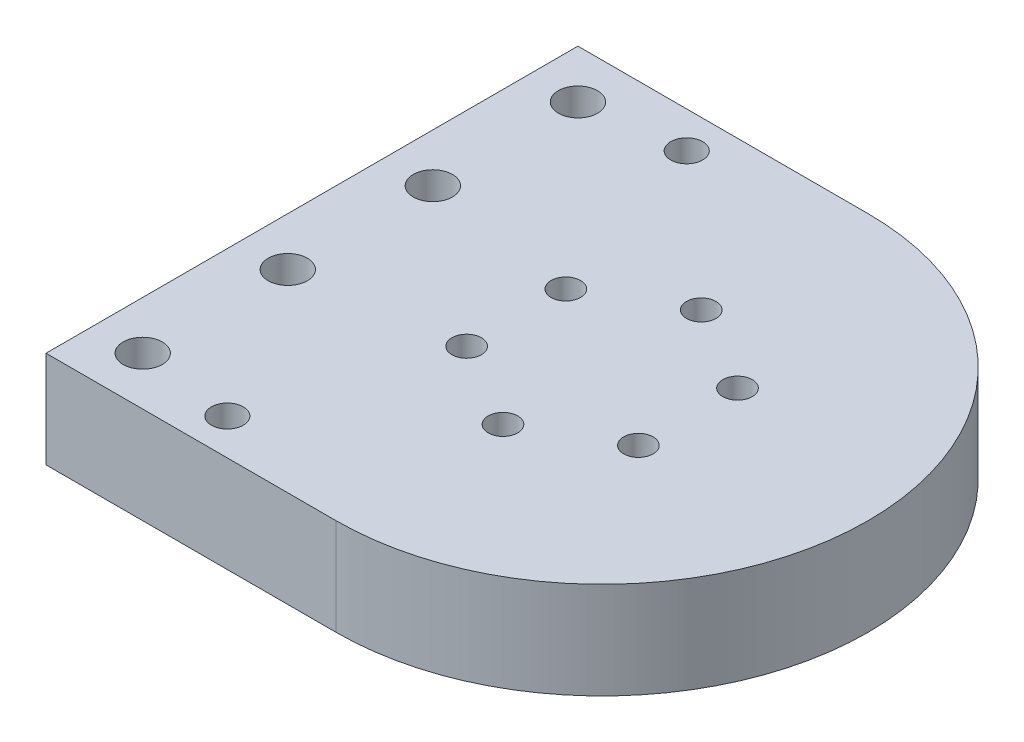
ISO-10303-21;
HEADER;
FILE_DESCRIPTION(('STEP AP214'),'2;1');
FILE_NAME('part.step','',(''),(''),'','','');
FILE_SCHEMA(('AUTOMOTIVE_DESIGN { 1 0 10303 214 1 1 1 1 }'));
ENDSEC;
DATA;
#1=APPLICATION_CONTEXT('core data for automotive mechanical design processes');
#2=APPLICATION_PROTOCOL_DEFINITION('international standard','automotive_design',2000,#1);
#3=PRODUCT_CONTEXT('',#1,'mechanical');
#4=PRODUCT('Part','Part','',(#3));
#5=PRODUCT_RELATED_PRODUCT_CATEGORY('part','',(#4));
#6=PRODUCT_DEFINITION_FORMATION('','',#4);
#7=PRODUCT_DEFINITION_CONTEXT('part definition',#1,'design');
#8=PRODUCT_DEFINITION('design','',#6,#7);
#9=PRODUCT_DEFINITION_SHAPE('','',#8);
#10=(LENGTH_UNIT() NAMED_UNIT(*) SI_UNIT(.MILLI.,.METRE.));
#11=(NAMED_UNIT(*) PLANE_ANGLE_UNIT() SI_UNIT($,.RADIAN.));
#12=(NAMED_UNIT(*) SI_UNIT($,.STERADIAN.) SOLID_ANGLE_UNIT());
#13=UNCERTAINTY_MEASURE_WITH_UNIT(LENGTH_MEASURE(1.E-05),#10,'distance_accuracy_value','');
#14=(GEOMETRIC_REPRESENTATION_CONTEXT(3) GLOBAL_UNCERTAINTY_ASSIGNED_CONTEXT((#13)) GLOBAL_UNIT_ASSIGNED_CONTEXT((#10,
#11,#12)) REPRESENTATION_CONTEXT('',''));
#15=CARTESIAN_POINT('',(0.,0.,0.));
#16=DIRECTION('',(0.,0.,1.));
#17=DIRECTION('',(1.,0.,0.));
#18=AXIS2_PLACEMENT_3D('',#15,#16,#17);
#19=CARTESIAN_POINT('',(0.,10.,0.));
#20=DIRECTION('',(0.,-1.,0.));
#21=DIRECTION('',(0.,0.,-1.));
#22=AXIS2_PLACEMENT_3D('',#19,#20,#21);
#23=CYLINDRICAL_SURFACE('',#22,27.5);
#24=CARTESIAN_POINT('',(0.,0.,0.));
#25=DIRECTION('',(0.,1.,0.));
#26=DIRECTION('',(0.,0.,1.));
#27=AXIS2_PLACEMENT_3D('',#24,#25,#26);
#28=CIRCLE('',#27,27.5);
#29=CARTESIAN_POINT('',(0.,0.,-27.5));
#30=VERTEX_POINT('',#29);
#31=CARTESIAN_POINT('',(0.,0.,27.5));
#32=VERTEX_POINT('',#31);
#33=EDGE_CURVE('E169',#30,#32,#28,.F.);
#34=ORIENTED_EDGE('',*,*,#33,.F.);
#35=DIRECTION('',(0.,-1.,0.));
#36=VECTOR('',#35,1.);
#37=CARTESIAN_POINT('',(0.,10.,-27.5));
#38=LINE('',#37,#36);
#39=CARTESIAN_POINT('',(0.,10.,-27.5));
#40=VERTEX_POINT('',#39);
#41=EDGE_CURVE('E11',#40,#30,#38,.T.);
#42=ORIENTED_EDGE('',*,*,#41,.F.);
#43=CARTESIAN_POINT('',(0.,10.,0.));
#44=DIRECTION('',(0.,1.,0.));
#45=DIRECTION('',(0.,0.,1.));
#46=AXIS2_PLACEMENT_3D('',#43,#44,#45);
#47=CIRCLE('',#46,27.5);
#48=CARTESIAN_POINT('',(0.,10.,27.5));
#49=VERTEX_POINT('',#48);
#50=EDGE_CURVE('E107',#40,#49,#47,.F.);
#51=ORIENTED_EDGE('',*,*,#50,.T.);
#52=DIRECTION('',(0.,-1.,0.));
#53=VECTOR('',#52,1.);
#54=CARTESIAN_POINT('',(0.,10.,27.5));
#55=LINE('',#54,#53);
#56=EDGE_CURVE('E87',#49,#32,#55,.T.);
#57=ORIENTED_EDGE('',*,*,#56,.T.);
#58=EDGE_LOOP('',(#34,#42,#51,#57));
#59=FACE_BOUND('',#58,.T.);
#60=ADVANCED_FACE('F47',(#59),#23,.T.);
#61=CARTESIAN_POINT('',(0.,10.,-27.5));
#62=DIRECTION('',(0.,0.,1.));
#63=DIRECTION('',(1.,0.,0.));
#64=AXIS2_PLACEMENT_3D('',#61,#62,#63);
#65=PLANE('',#64);
#66=DIRECTION('',(-1.,0.,0.));
#67=VECTOR('',#66,1.);
#68=CARTESIAN_POINT('',(0.,0.,-27.5));
#69=LINE('',#68,#67);
#70=CARTESIAN_POINT('',(-30.,0.,-27.5));
#71=VERTEX_POINT('',#70);
#72=EDGE_CURVE('E113',#30,#71,#69,.T.);
#73=ORIENTED_EDGE('',*,*,#72,.T.);
#74=DIRECTION('',(0.,-1.,0.));
#75=VECTOR('',#74,1.);
#76=CARTESIAN_POINT('',(-30.,10.,-27.5));
#77=LINE('',#76,#75);
#78=CARTESIAN_POINT('',(-30.,10.,-27.5));
#79=VERTEX_POINT('',#78);
#80=EDGE_CURVE('E57',#79,#71,#77,.T.);
#81=ORIENTED_EDGE('',*,*,#80,.F.);
#82=DIRECTION('',(-1.,0.,0.));
#83=VECTOR('',#82,1.);
#84=CARTESIAN_POINT('',(0.,10.,-27.5));
#85=LINE('',#84,#83);
#86=EDGE_CURVE('E103',#40,#79,#85,.T.);
#87=ORIENTED_EDGE('',*,*,#86,.F.);
#88=ORIENTED_EDGE('',*,*,#41,.T.);
#89=EDGE_LOOP('',(#73,#81,#87,#88));
#90=FACE_BOUND('',#89,.T.);
#91=ADVANCED_FACE('F111',(#90),#65,.F.);
#92=CARTESIAN_POINT('',(-30.,10.,0.));
#93=DIRECTION('',(1.,0.,0.));
#94=DIRECTION('',(0.,0.,-1.));
#95=AXIS2_PLACEMENT_3D('',#92,#93,#94);
#96=PLANE('',#95);
#97=DIRECTION('',(0.,0.,1.));
#98=VECTOR('',#97,1.);
#99=CARTESIAN_POINT('',(-30.,0.,0.));
#100=LINE('',#99,#98);
#101=CARTESIAN_POINT('',(-30.,0.,27.5));
#102=VERTEX_POINT('',#101);
#103=EDGE_CURVE('E164',#71,#102,#100,.T.);
#104=ORIENTED_EDGE('',*,*,#103,.T.);
#105=DIRECTION('',(0.,-1.,0.));
#106=VECTOR('',#105,1.);
#107=CARTESIAN_POINT('',(-30.,10.,27.5));
#108=LINE('',#107,#106);
#109=CARTESIAN_POINT('',(-30.,10.,27.5));
#110=VERTEX_POINT('',#109);
#111=EDGE_CURVE('E101',#110,#102,#108,.T.);
#112=ORIENTED_EDGE('',*,*,#111,.F.);
#113=DIRECTION('',(0.,0.,1.));
#114=VECTOR('',#113,1.);
#115=CARTESIAN_POINT('',(-30.,10.,0.));
#116=LINE('',#115,#114);
#117=EDGE_CURVE('E95',#79,#110,#116,.T.);
#118=ORIENTED_EDGE('',*,*,#117,.F.);
#119=ORIENTED_EDGE('',*,*,#80,.T.);
#120=EDGE_LOOP('',(#104,#112,#118,#119));
#121=FACE_BOUND('',#120,.T.);
#122=ADVANCED_FACE('F98',(#121),#96,.F.);
#123=CARTESIAN_POINT('',(-25.,10.,-7.5));
#124=DIRECTION('',(0.,-1.,0.));
#125=DIRECTION('',(0.,0.,-1.));
#126=AXIS2_PLACEMENT_3D('',#123,#124,#125);
#127=CYLINDRICAL_SURFACE('',#126,2.025);
#128=CARTESIAN_POINT('',(-25.,10.,-7.5));
#129=DIRECTION('',(0.,1.,0.));
#130=DIRECTION('',(0.,0.,1.));
#131=AXIS2_PLACEMENT_3D('',#128,#129,#130);
#132=CIRCLE('',#131,2.025);
#133=CARTESIAN_POINT('',(-25.,10.,-5.475));
#134=VERTEX_POINT('',#133);
#135=EDGE_CURVE('E183',#134,#134,#132,.T.);
#136=ORIENTED_EDGE('',*,*,#135,.T.);
#137=EDGE_LOOP('',(#136));
#138=FACE_BOUND('',#137,.T.);
#139=CARTESIAN_POINT('',(-25.,0.,-7.5));
#140=DIRECTION('',(0.,1.,0.));
#141=DIRECTION('',(0.,0.,1.));
#142=AXIS2_PLACEMENT_3D('',#139,#140,#141);
#143=CIRCLE('',#142,2.025);
#144=CARTESIAN_POINT('',(-25.,0.,-5.475));
#145=VERTEX_POINT('',#144);
#146=EDGE_CURVE('E126',#145,#145,#143,.T.);
#147=ORIENTED_EDGE('',*,*,#146,.F.);
#148=EDGE_LOOP('',(#147));
#149=FACE_BOUND('',#148,.T.);
#150=ADVANCED_FACE('F286',(#138,#149),#127,.F.);
#151=CARTESIAN_POINT('',(-25.,10.,7.5));
#152=DIRECTION('',(0.,-1.,0.));
#153=DIRECTION('',(0.,0.,-1.));
#154=AXIS2_PLACEMENT_3D('',#151,#152,#153);
#155=CYLINDRICAL_SURFACE('',#154,2.025);
#156=CARTESIAN_POINT('',(-25.,10.,7.5));
#157=DIRECTION('',(0.,1.,0.));
#158=DIRECTION('',(0.,0.,1.));
#159=AXIS2_PLACEMENT_3D('',#156,#157,#158);
#160=CIRCLE('',#159,2.025);
#161=CARTESIAN_POINT('',(-25.,10.,9.525));
#162=VERTEX_POINT('',#161);
#163=EDGE_CURVE('E187',#162,#162,#160,.T.);
#164=ORIENTED_EDGE('',*,*,#163,.T.);
#165=EDGE_LOOP('',(#164));
#166=FACE_BOUND('',#165,.T.);
#167=CARTESIAN_POINT('',(-25.,0.,7.5));
#168=DIRECTION('',(0.,1.,0.));
#169=DIRECTION('',(0.,0.,1.));
#170=AXIS2_PLACEMENT_3D('',#167,#168,#169);
#171=CIRCLE('',#170,2.025);
#172=CARTESIAN_POINT('',(-25.,0.,9.525));
#173=VERTEX_POINT('',#172);
#174=EDGE_CURVE('E130',#173,#173,#171,.T.);
#175=ORIENTED_EDGE('',*,*,#174,.F.);
#176=EDGE_LOOP('',(#175));
#177=FACE_BOUND('',#176,.T.);
#178=ADVANCED_FACE('F317',(#166,#177),#155,.F.);
#179=CARTESIAN_POINT('',(-25.,10.,22.5));
#180=DIRECTION('',(0.,-1.,0.));
#181=DIRECTION('',(0.,0.,-1.));
#182=AXIS2_PLACEMENT_3D('',#179,#180,#181);
#183=CYLINDRICAL_SURFACE('',#182,2.025);
#184=CARTESIAN_POINT('',(-25.,10.,22.5));
#185=DIRECTION('',(0.,1.,0.));
#186=DIRECTION('',(0.,0.,1.));
#187=AXIS2_PLACEMENT_3D('',#184,#185,#186);
#188=CIRCLE('',#187,2.025);
#189=CARTESIAN_POINT('',(-25.,10.,24.525));
#190=VERTEX_POINT('',#189);
#191=EDGE_CURVE('E191',#190,#190,#188,.T.);
#192=ORIENTED_EDGE('',*,*,#191,.T.);
#193=EDGE_LOOP('',(#192));
#194=FACE_BOUND('',#193,.T.);
#195=CARTESIAN_POINT('',(-25.,0.,22.5));
#196=DIRECTION('',(0.,1.,0.));
#197=DIRECTION('',(0.,0.,1.));
#198=AXIS2_PLACEMENT_3D('',#195,#196,#197);
#199=CIRCLE('',#198,2.025);
#200=CARTESIAN_POINT('',(-25.,0.,24.525));
#201=VERTEX_POINT('',#200);
#202=EDGE_CURVE('E134',#201,#201,#199,.T.);
#203=ORIENTED_EDGE('',*,*,#202,.F.);
#204=EDGE_LOOP('',(#203));
#205=FACE_BOUND('',#204,.T.);
#206=ADVANCED_FACE('F313',(#194,#205),#183,.F.);
#207=CARTESIAN_POINT('',(0.,10.,-10.25));
#208=DIRECTION('',(0.,-1.,0.));
#209=DIRECTION('',(0.,0.,-1.));
#210=AXIS2_PLACEMENT_3D('',#207,#208,#209);
#211=CYLINDRICAL_SURFACE('',#210,1.525);
#212=CARTESIAN_POINT('',(0.,10.,-10.25));
#213=DIRECTION('',(0.,1.,0.));
#214=DIRECTION('',(0.,0.,1.));
#215=AXIS2_PLACEMENT_3D('',#212,#213,#214);
#216=CIRCLE('',#215,1.525);
#217=CARTESIAN_POINT('',(0.,10.,-8.725));
#218=VERTEX_POINT('',#217);
#219=EDGE_CURVE('E195',#218,#218,#216,.T.);
#220=ORIENTED_EDGE('',*,*,#219,.T.);
#221=EDGE_LOOP('',(#220));
#222=FACE_BOUND('',#221,.T.);
#223=CARTESIAN_POINT('',(0.,0.,-10.25));
#224=DIRECTION('',(0.,1.,0.));
#225=DIRECTION('',(0.,0.,1.));
#226=AXIS2_PLACEMENT_3D('',#223,#224,#225);
#227=CIRCLE('',#226,1.525);
#228=CARTESIAN_POINT('',(0.,0.,-8.725));
#229=VERTEX_POINT('',#228);
#230=EDGE_CURVE('E138',#229,#229,#227,.T.);
#231=ORIENTED_EDGE('',*,*,#230,.F.);
#232=EDGE_LOOP('',(#231));
#233=FACE_BOUND('',#232,.T.);
#234=ADVANCED_FACE('F309',(#222,#233),#211,.F.);
#235=CARTESIAN_POINT('',(8.8767603887905,10.,-5.125));
#236=DIRECTION('',(0.,-1.,0.));
#237=DIRECTION('',(0.,0.,-1.));
#238=AXIS2_PLACEMENT_3D('',#235,#236,#237);
#239=CYLINDRICAL_SURFACE('',#238,1.525);
#240=CARTESIAN_POINT('',(8.8767603887905,10.,-5.125));
#241=DIRECTION('',(0.,1.,0.));
#242=DIRECTION('',(0.,0.,1.));
#243=AXIS2_PLACEMENT_3D('',#240,#241,#242);
#244=CIRCLE('',#243,1.525);
#245=CARTESIAN_POINT('',(8.8767603887905,10.,-3.6));
#246=VERTEX_POINT('',#245);
#247=EDGE_CURVE('E199',#246,#246,#244,.T.);
#248=ORIENTED_EDGE('',*,*,#247,.T.);
#249=EDGE_LOOP('',(#248));
#250=FACE_BOUND('',#249,.T.);
#251=CARTESIAN_POINT('',(8.8767603887905,0.,-5.125));
#252=DIRECTION('',(0.,1.,0.));
#253=DIRECTION('',(0.,0.,1.));
#254=AXIS2_PLACEMENT_3D('',#251,#252,#253);
#255=CIRCLE('',#254,1.525);
#256=CARTESIAN_POINT('',(8.8767603887905,0.,-3.6));
#257=VERTEX_POINT('',#256);
#258=EDGE_CURVE('E142',#257,#257,#255,.T.);
#259=ORIENTED_EDGE('',*,*,#258,.F.);
#260=EDGE_LOOP('',(#259));
#261=FACE_BOUND('',#260,.T.);
#262=ADVANCED_FACE('F305',(#250,#261),#239,.F.);
#263=CARTESIAN_POINT('',(8.8767603887905,10.,5.125));
#264=DIRECTION('',(0.,-1.,0.));
#265=DIRECTION('',(0.,0.,-1.));
#266=AXIS2_PLACEMENT_3D('',#263,#264,#265);
#267=CYLINDRICAL_SURFACE('',#266,1.525);
#268=CARTESIAN_POINT('',(8.8767603887905,10.,5.125));
#269=DIRECTION('',(0.,1.,0.));
#270=DIRECTION('',(0.,0.,1.));
#271=AXIS2_PLACEMENT_3D('',#268,#269,#270);
#272=CIRCLE('',#271,1.525);
#273=CARTESIAN_POINT('',(8.8767603887905,10.,6.65));
#274=VERTEX_POINT('',#273);
#275=EDGE_CURVE('E203',#274,#274,#272,.T.);
#276=ORIENTED_EDGE('',*,*,#275,.T.);
#277=EDGE_LOOP('',(#276));
#278=FACE_BOUND('',#277,.T.);
#279=CARTESIAN_POINT('',(8.8767603887905,0.,5.125));
#280=DIRECTION('',(0.,1.,0.));
#281=DIRECTION('',(0.,0.,1.));
#282=AXIS2_PLACEMENT_3D('',#279,#280,#281);
#283=CIRCLE('',#282,1.525);
#284=CARTESIAN_POINT('',(8.8767603887905,0.,6.65));
#285=VERTEX_POINT('',#284);
#286=EDGE_CURVE('E146',#285,#285,#283,.T.);
#287=ORIENTED_EDGE('',*,*,#286,.F.);
#288=EDGE_LOOP('',(#287));
#289=FACE_BOUND('',#288,.T.);
#290=ADVANCED_FACE('F301',(#278,#289),#267,.F.);
#291=CARTESIAN_POINT('',(0.,10.,10.25));
#292=DIRECTION('',(0.,-1.,0.));
#293=DIRECTION('',(0.,0.,-1.));
#294=AXIS2_PLACEMENT_3D('',#291,#292,#293);
#295=CYLINDRICAL_SURFACE('',#294,1.525);
#296=CARTESIAN_POINT('',(0.,10.,10.25));
#297=DIRECTION('',(0.,1.,0.));
#298=DIRECTION('',(0.,0.,1.));
#299=AXIS2_PLACEMENT_3D('',#296,#297,#298);
#300=CIRCLE('',#299,1.525);
#301=CARTESIAN_POINT('',(0.,10.,11.775));
#302=VERTEX_POINT('',#301);
#303=EDGE_CURVE('E207',#302,#302,#300,.T.);
#304=ORIENTED_EDGE('',*,*,#303,.T.);
#305=EDGE_LOOP('',(#304));
#306=FACE_BOUND('',#305,.T.);
#307=CARTESIAN_POINT('',(0.,0.,10.25));
#308=DIRECTION('',(0.,1.,0.));
#309=DIRECTION('',(0.,0.,1.));
#310=AXIS2_PLACEMENT_3D('',#307,#308,#309);
#311=CIRCLE('',#310,1.525);
#312=CARTESIAN_POINT('',(0.,0.,11.775));
#313=VERTEX_POINT('',#312);
#314=EDGE_CURVE('E150',#313,#313,#311,.T.);
#315=ORIENTED_EDGE('',*,*,#314,.F.);
#316=EDGE_LOOP('',(#315));
#317=FACE_BOUND('',#316,.T.);
#318=ADVANCED_FACE('F297',(#306,#317),#295,.F.);
#319=CARTESIAN_POINT('',(-15.,10.,-23.75));
#320=DIRECTION('',(0.,-1.,0.));
#321=DIRECTION('',(0.,0.,-1.));
#322=AXIS2_PLACEMENT_3D('',#319,#320,#321);
#323=CYLINDRICAL_SURFACE('',#322,1.65);
#324=CARTESIAN_POINT('',(-15.,10.,-23.75));
#325=DIRECTION('',(0.,1.,0.));
#326=DIRECTION('',(0.,0.,1.));
#327=AXIS2_PLACEMENT_3D('',#324,#325,#326);
#328=CIRCLE('',#327,1.65);
#329=CARTESIAN_POINT('',(-15.,10.,-22.1));
#330=VERTEX_POINT('',#329);
#331=EDGE_CURVE('E211',#330,#330,#328,.T.);
#332=ORIENTED_EDGE('',*,*,#331,.T.);
#333=EDGE_LOOP('',(#332));
#334=FACE_BOUND('',#333,.T.);
#335=CARTESIAN_POINT('',(-15.,0.,-23.75));
#336=DIRECTION('',(0.,1.,0.));
#337=DIRECTION('',(0.,0.,1.));
#338=AXIS2_PLACEMENT_3D('',#335,#336,#337);
#339=CIRCLE('',#338,1.65);
#340=CARTESIAN_POINT('',(-15.,0.,-22.1));
#341=VERTEX_POINT('',#340);
#342=EDGE_CURVE('E154',#341,#341,#339,.T.);
#343=ORIENTED_EDGE('',*,*,#342,.F.);
#344=EDGE_LOOP('',(#343));
#345=FACE_BOUND('',#344,.T.);
#346=ADVANCED_FACE('F293',(#334,#345),#323,.F.);
#347=CARTESIAN_POINT('',(-15.,10.,23.75));
#348=DIRECTION('',(0.,-1.,0.));
#349=DIRECTION('',(0.,0.,-1.));
#350=AXIS2_PLACEMENT_3D('',#347,#348,#349);
#351=CYLINDRICAL_SURFACE('',#350,1.65);
#352=CARTESIAN_POINT('',(-15.,10.,23.75));
#353=DIRECTION('',(0.,1.,0.));
#354=DIRECTION('',(0.,0.,1.));
#355=AXIS2_PLACEMENT_3D('',#352,#353,#354);
#356=CIRCLE('',#355,1.65);
#357=CARTESIAN_POINT('',(-15.,10.,25.4));
#358=VERTEX_POINT('',#357);
#359=EDGE_CURVE('E215',#358,#358,#356,.T.);
#360=ORIENTED_EDGE('',*,*,#359,.T.);
#361=EDGE_LOOP('',(#360));
#362=FACE_BOUND('',#361,.T.);
#363=CARTESIAN_POINT('',(-15.,0.,23.75));
#364=DIRECTION('',(0.,1.,0.));
#365=DIRECTION('',(0.,0.,1.));
#366=AXIS2_PLACEMENT_3D('',#363,#364,#365);
#367=CIRCLE('',#366,1.65);
#368=CARTESIAN_POINT('',(-15.,0.,25.4));
#369=VERTEX_POINT('',#368);
#370=EDGE_CURVE('E158',#369,#369,#367,.T.);
#371=ORIENTED_EDGE('',*,*,#370,.F.);
#372=EDGE_LOOP('',(#371));
#373=FACE_BOUND('',#372,.T.);
#374=ADVANCED_FACE('F289',(#362,#373),#351,.F.);
#375=CARTESIAN_POINT('',(0.,10.,27.5));
#376=DIRECTION('',(0.,0.,-1.));
#377=DIRECTION('',(-1.,0.,0.));
#378=AXIS2_PLACEMENT_3D('',#375,#376,#377);
#379=PLANE('',#378);
#380=DIRECTION('',(1.,0.,0.));
#381=VECTOR('',#380,1.);
#382=CARTESIAN_POINT('',(0.,0.,27.5));
#383=LINE('',#382,#381);
#384=EDGE_CURVE('E80',#102,#32,#383,.T.);
#385=ORIENTED_EDGE('',*,*,#384,.T.);
#386=ORIENTED_EDGE('',*,*,#56,.F.);
#387=DIRECTION('',(1.,0.,0.));
#388=VECTOR('',#387,1.);
#389=CARTESIAN_POINT('',(0.,10.,27.5));
#390=LINE('',#389,#388);
#391=EDGE_CURVE('E65',#110,#49,#390,.T.);
#392=ORIENTED_EDGE('',*,*,#391,.F.);
#393=ORIENTED_EDGE('',*,*,#111,.T.);
#394=EDGE_LOOP('',(#385,#386,#392,#393));
#395=FACE_BOUND('',#394,.T.);
#396=ADVANCED_FACE('F243',(#395),#379,.F.);
#397=CARTESIAN_POINT('',(-8.8767603887905,10.,5.125));
#398=DIRECTION('',(0.,-1.,0.));
#399=DIRECTION('',(0.,0.,-1.));
#400=AXIS2_PLACEMENT_3D('',#397,#398,#399);
#401=CYLINDRICAL_SURFACE('',#400,1.525);
#402=CARTESIAN_POINT('',(-8.8767603887905,10.,5.125));
#403=DIRECTION('',(0.,1.,0.));
#404=DIRECTION('',(0.,0.,1.));
#405=AXIS2_PLACEMENT_3D('',#402,#403,#404);
#406=CIRCLE('',#405,1.525);
#407=CARTESIAN_POINT('',(-8.8767603887905,10.,6.65));
#408=VERTEX_POINT('',#407);
#409=EDGE_CURVE('E223',#408,#408,#406,.T.);
#410=ORIENTED_EDGE('',*,*,#409,.T.);
#411=EDGE_LOOP('',(#410));
#412=FACE_BOUND('',#411,.T.);
#413=CARTESIAN_POINT('',(-8.8767603887905,0.,5.125));
#414=DIRECTION('',(0.,1.,0.));
#415=DIRECTION('',(0.,0.,1.));
#416=AXIS2_PLACEMENT_3D('',#413,#414,#415);
#417=CIRCLE('',#416,1.525);
#418=CARTESIAN_POINT('',(-8.8767603887905,0.,6.65));
#419=VERTEX_POINT('',#418);
#420=EDGE_CURVE('E172',#419,#419,#417,.T.);
#421=ORIENTED_EDGE('',*,*,#420,.F.);
#422=EDGE_LOOP('',(#421));
#423=FACE_BOUND('',#422,.T.);
#424=ADVANCED_FACE('F240',(#412,#423),#401,.F.);
#425=CARTESIAN_POINT('',(-8.8767603887905,10.,-5.12499999999999));
#426=DIRECTION('',(0.,-1.,0.));
#427=DIRECTION('',(0.,0.,-1.));
#428=AXIS2_PLACEMENT_3D('',#425,#426,#427);
#429=CYLINDRICAL_SURFACE('',#428,1.525);
#430=CARTESIAN_POINT('',(-8.8767603887905,10.,-5.12499999999999));
#431=DIRECTION('',(0.,1.,0.));
#432=DIRECTION('',(0.,0.,1.));
#433=AXIS2_PLACEMENT_3D('',#430,#431,#432);
#434=CIRCLE('',#433,1.525);
#435=CARTESIAN_POINT('',(-8.8767603887905,10.,-3.59999999999999));
#436=VERTEX_POINT('',#435);
#437=EDGE_CURVE('E125',#436,#436,#434,.T.);
#438=ORIENTED_EDGE('',*,*,#437,.T.);
#439=EDGE_LOOP('',(#438));
#440=FACE_BOUND('',#439,.T.);
#441=CARTESIAN_POINT('',(-8.8767603887905,0.,-5.12499999999999));
#442=DIRECTION('',(0.,1.,0.));
#443=DIRECTION('',(0.,0.,1.));
#444=AXIS2_PLACEMENT_3D('',#441,#442,#443);
#445=CIRCLE('',#444,1.525);
#446=CARTESIAN_POINT('',(-8.8767603887905,0.,-3.59999999999999));
#447=VERTEX_POINT('',#446);
#448=EDGE_CURVE('E176',#447,#447,#445,.T.);
#449=ORIENTED_EDGE('',*,*,#448,.F.);
#450=EDGE_LOOP('',(#449));
#451=FACE_BOUND('',#450,.T.);
#452=ADVANCED_FACE('F49',(#440,#451),#429,.F.);
#453=CARTESIAN_POINT('',(-25.,10.,-22.5));
#454=DIRECTION('',(0.,-1.,0.));
#455=DIRECTION('',(0.,0.,-1.));
#456=AXIS2_PLACEMENT_3D('',#453,#454,#455);
#457=CYLINDRICAL_SURFACE('',#456,2.025);
#458=CARTESIAN_POINT('',(-25.,10.,-22.5));
#459=DIRECTION('',(0.,1.,0.));
#460=DIRECTION('',(0.,0.,1.));
#461=AXIS2_PLACEMENT_3D('',#458,#459,#460);
#462=CIRCLE('',#461,2.025);
#463=CARTESIAN_POINT('',(-25.,10.,-20.475));
#464=VERTEX_POINT('',#463);
#465=EDGE_CURVE('E120',#464,#464,#462,.T.);
#466=ORIENTED_EDGE('',*,*,#465,.T.);
#467=EDGE_LOOP('',(#466));
#468=FACE_BOUND('',#467,.T.);
#469=CARTESIAN_POINT('',(-25.,0.,-22.5));
#470=DIRECTION('',(0.,1.,0.));
#471=DIRECTION('',(0.,0.,1.));
#472=AXIS2_PLACEMENT_3D('',#469,#470,#471);
#473=CIRCLE('',#472,2.025);
#474=CARTESIAN_POINT('',(-25.,0.,-20.475));
#475=VERTEX_POINT('',#474);
#476=EDGE_CURVE('E121',#475,#475,#473,.T.);
#477=ORIENTED_EDGE('',*,*,#476,.F.);
#478=EDGE_LOOP('',(#477));
#479=FACE_BOUND('',#478,.T.);
#480=ADVANCED_FACE('F236',(#468,#479),#457,.F.);
#481=CARTESIAN_POINT('',(0.,10.,0.));
#482=DIRECTION('',(0.,1.,0.));
#483=DIRECTION('',(0.,0.,1.));
#484=AXIS2_PLACEMENT_3D('',#481,#482,#483);
#485=PLANE('',#484);
#486=ORIENTED_EDGE('',*,*,#437,.F.);
#487=EDGE_LOOP('',(#486));
#488=FACE_BOUND('',#487,.T.);
#489=ORIENTED_EDGE('',*,*,#409,.F.);
#490=EDGE_LOOP('',(#489));
#491=FACE_BOUND('',#490,.T.);
#492=ORIENTED_EDGE('',*,*,#50,.F.);
#493=ORIENTED_EDGE('',*,*,#86,.T.);
#494=ORIENTED_EDGE('',*,*,#117,.T.);
#495=ORIENTED_EDGE('',*,*,#391,.T.);
#496=EDGE_LOOP('',(#492,#493,#494,#495));
#497=FACE_BOUND('',#496,.T.);
#498=ORIENTED_EDGE('',*,*,#359,.F.);
#499=EDGE_LOOP('',(#498));
#500=FACE_BOUND('',#499,.T.);
#501=ORIENTED_EDGE('',*,*,#331,.F.);
#502=EDGE_LOOP('',(#501));
#503=FACE_BOUND('',#502,.T.);
#504=ORIENTED_EDGE('',*,*,#303,.F.);
#505=EDGE_LOOP('',(#504));
#506=FACE_BOUND('',#505,.T.);
#507=ORIENTED_EDGE('',*,*,#275,.F.);
#508=EDGE_LOOP('',(#507));
#509=FACE_BOUND('',#508,.T.);
#510=ORIENTED_EDGE('',*,*,#247,.F.);
#511=EDGE_LOOP('',(#510));
#512=FACE_BOUND('',#511,.T.);
#513=ORIENTED_EDGE('',*,*,#219,.F.);
#514=EDGE_LOOP('',(#513));
#515=FACE_BOUND('',#514,.T.);
#516=ORIENTED_EDGE('',*,*,#191,.F.);
#517=EDGE_LOOP('',(#516));
#518=FACE_BOUND('',#517,.T.);
#519=ORIENTED_EDGE('',*,*,#163,.F.);
#520=EDGE_LOOP('',(#519));
#521=FACE_BOUND('',#520,.T.);
#522=ORIENTED_EDGE('',*,*,#135,.F.);
#523=EDGE_LOOP('',(#522));
#524=FACE_BOUND('',#523,.T.);
#525=ORIENTED_EDGE('',*,*,#465,.F.);
#526=EDGE_LOOP('',(#525));
#527=FACE_BOUND('',#526,.T.);
#528=ADVANCED_FACE('F105',(#488,#491,#497,#500,#503,#506,#509,#512,#515,#518,#521,#524,#527),
#485,.T.);
#529=CARTESIAN_POINT('',(0.,0.,0.));
#530=DIRECTION('',(0.,1.,0.));
#531=DIRECTION('',(0.,0.,1.));
#532=AXIS2_PLACEMENT_3D('',#529,#530,#531);
#533=PLANE('',#532);
#534=ORIENTED_EDGE('',*,*,#448,.T.);
#535=EDGE_LOOP('',(#534));
#536=FACE_BOUND('',#535,.T.);
#537=ORIENTED_EDGE('',*,*,#420,.T.);
#538=EDGE_LOOP('',(#537));
#539=FACE_BOUND('',#538,.T.);
#540=ORIENTED_EDGE('',*,*,#33,.T.);
#541=ORIENTED_EDGE('',*,*,#384,.F.);
#542=ORIENTED_EDGE('',*,*,#103,.F.);
#543=ORIENTED_EDGE('',*,*,#72,.F.);
#544=EDGE_LOOP('',(#540,#541,#542,#543));
#545=FACE_BOUND('',#544,.T.);
#546=ORIENTED_EDGE('',*,*,#370,.T.);
#547=EDGE_LOOP('',(#546));
#548=FACE_BOUND('',#547,.T.);
#549=ORIENTED_EDGE('',*,*,#342,.T.);
#550=EDGE_LOOP('',(#549));
#551=FACE_BOUND('',#550,.T.);
#552=ORIENTED_EDGE('',*,*,#314,.T.);
#553=EDGE_LOOP('',(#552));
#554=FACE_BOUND('',#553,.T.);
#555=ORIENTED_EDGE('',*,*,#286,.T.);
#556=EDGE_LOOP('',(#555));
#557=FACE_BOUND('',#556,.T.);
#558=ORIENTED_EDGE('',*,*,#258,.T.);
#559=EDGE_LOOP('',(#558));
#560=FACE_BOUND('',#559,.T.);
#561=ORIENTED_EDGE('',*,*,#230,.T.);
#562=EDGE_LOOP('',(#561));
#563=FACE_BOUND('',#562,.T.);
#564=ORIENTED_EDGE('',*,*,#202,.T.);
#565=EDGE_LOOP('',(#564));
#566=FACE_BOUND('',#565,.T.);
#567=ORIENTED_EDGE('',*,*,#174,.T.);
#568=EDGE_LOOP('',(#567));
#569=FACE_BOUND('',#568,.T.);
#570=ORIENTED_EDGE('',*,*,#146,.T.);
#571=EDGE_LOOP('',(#570));
#572=FACE_BOUND('',#571,.T.);
#573=ORIENTED_EDGE('',*,*,#476,.T.);
#574=EDGE_LOOP('',(#573));
#575=FACE_BOUND('',#574,.T.);
#576=ADVANCED_FACE('F235',(#536,#539,#545,#548,#551,#554,#557,#560,#563,#566,#569,#572,#575),
#533,.F.);
#577=CLOSED_SHELL('',(#60,#91,#122,#150,#178,#206,#234,#262,#290,#318,#346,#374,#396,#424,#452,
#480,#528,#576));
#578=MANIFOLD_SOLID_BREP('B2',#577);
#579=ADVANCED_BREP_SHAPE_REPRESENTATION('',(#18,#578),#14);
#580=SHAPE_DEFINITION_REPRESENTATION(#9,#579);
ENDSEC;
END-ISO-10303-21;
